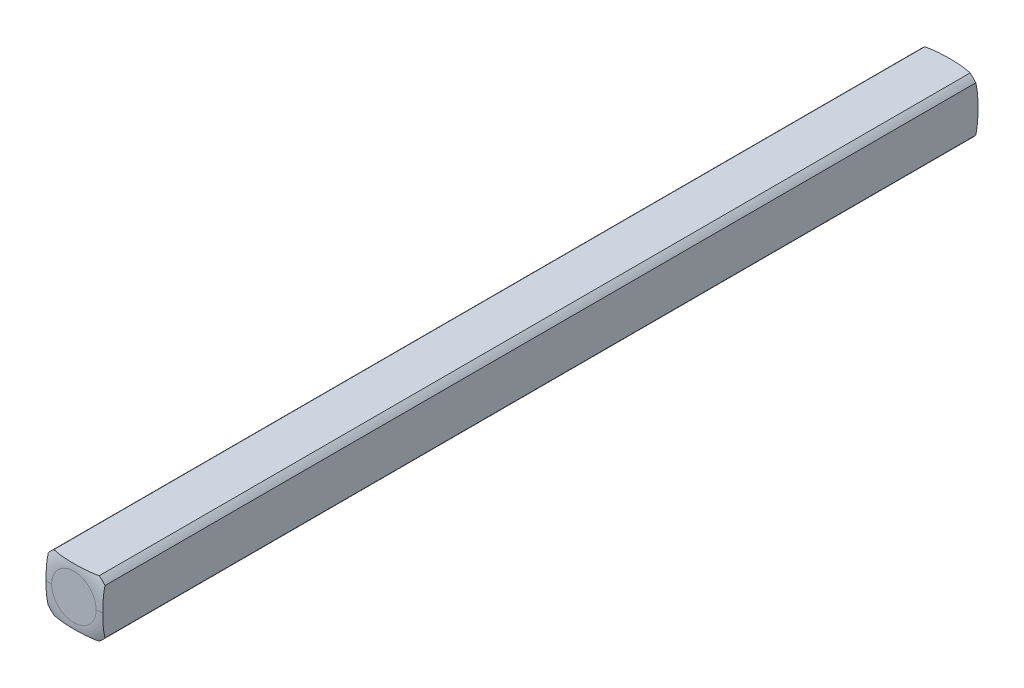
ISO-10303-21;
HEADER;
FILE_DESCRIPTION(('STEP AP214'),'2;1');
FILE_NAME('part.step','',(''),(''),'','','');
FILE_SCHEMA(('AUTOMOTIVE_DESIGN { 1 0 10303 214 1 1 1 1 }'));
ENDSEC;
DATA;
#1=APPLICATION_CONTEXT('core data for automotive mechanical design processes');
#2=APPLICATION_PROTOCOL_DEFINITION('international standard','automotive_design',2000,#1);
#3=PRODUCT_CONTEXT('',#1,'mechanical');
#4=PRODUCT('Part','Part','',(#3));
#5=PRODUCT_RELATED_PRODUCT_CATEGORY('part','',(#4));
#6=PRODUCT_DEFINITION_FORMATION('','',#4);
#7=PRODUCT_DEFINITION_CONTEXT('part definition',#1,'design');
#8=PRODUCT_DEFINITION('design','',#6,#7);
#9=PRODUCT_DEFINITION_SHAPE('','',#8);
#10=(LENGTH_UNIT() NAMED_UNIT(*) SI_UNIT(.MILLI.,.METRE.));
#11=(NAMED_UNIT(*) PLANE_ANGLE_UNIT() SI_UNIT($,.RADIAN.));
#12=(NAMED_UNIT(*) SI_UNIT($,.STERADIAN.) SOLID_ANGLE_UNIT());
#13=UNCERTAINTY_MEASURE_WITH_UNIT(LENGTH_MEASURE(1.E-05),#10,'distance_accuracy_value','');
#14=(GEOMETRIC_REPRESENTATION_CONTEXT(3) GLOBAL_UNCERTAINTY_ASSIGNED_CONTEXT((#13)) GLOBAL_UNIT_ASSIGNED_CONTEXT((#10,
#11,#12)) REPRESENTATION_CONTEXT('',''));
#15=CARTESIAN_POINT('',(0.,0.,0.));
#16=DIRECTION('',(0.,0.,1.));
#17=DIRECTION('',(1.,0.,0.));
#18=AXIS2_PLACEMENT_3D('',#15,#16,#17);
#19=CARTESIAN_POINT('',(0.,0.,-24.511));
#20=DIRECTION('',(0.,0.,1.));
#21=DIRECTION('',(1.,0.,0.));
#22=AXIS2_PLACEMENT_3D('',#19,#20,#21);
#23=CYLINDRICAL_SURFACE('',#22,2.032);
#24=CARTESIAN_POINT('',(0.,0.,-24.359919142098));
#25=DIRECTION('',(0.,0.,1.));
#26=DIRECTION('',(1.,0.,0.));
#27=AXIS2_PLACEMENT_3D('',#24,#25,#26);
#28=CIRCLE('',#27,2.032);
#29=CARTESIAN_POINT('',(-1.26841150657032,1.5875,-24.359919142098));
#30=VERTEX_POINT('',#29);
#31=CARTESIAN_POINT('',(-1.5875,1.26841150657032,-24.359919142098));
#32=VERTEX_POINT('',#31);
#33=EDGE_CURVE('E145',#30,#32,#28,.T.);
#34=ORIENTED_EDGE('',*,*,#33,.T.);
#35=DIRECTION('',(0.,0.,1.));
#36=VECTOR('',#35,1.);
#37=CARTESIAN_POINT('',(-1.5875,1.26841150657032,-24.511));
#38=LINE('',#37,#36);
#39=CARTESIAN_POINT('',(-1.5875,1.26841150657032,24.359919142098));
#40=VERTEX_POINT('',#39);
#41=EDGE_CURVE('E125',#32,#40,#38,.T.);
#42=ORIENTED_EDGE('',*,*,#41,.T.);
#43=CARTESIAN_POINT('',(0.,0.,24.359919142098));
#44=DIRECTION('',(0.,0.,-1.));
#45=DIRECTION('',(-1.,0.,0.));
#46=AXIS2_PLACEMENT_3D('',#43,#44,#45);
#47=CIRCLE('',#46,2.032);
#48=CARTESIAN_POINT('',(-1.26841150657032,1.5875,24.359919142098));
#49=VERTEX_POINT('',#48);
#50=EDGE_CURVE('E9',#40,#49,#47,.T.);
#51=ORIENTED_EDGE('',*,*,#50,.T.);
#52=DIRECTION('',(0.,0.,-1.));
#53=VECTOR('',#52,1.);
#54=CARTESIAN_POINT('',(-1.26841150657032,1.5875,-24.511));
#55=LINE('',#54,#53);
#56=EDGE_CURVE('E143',#49,#30,#55,.T.);
#57=ORIENTED_EDGE('',*,*,#56,.T.);
#58=EDGE_LOOP('',(#34,#42,#51,#57));
#59=FACE_BOUND('',#58,.T.);
#60=ADVANCED_FACE('F15',(#59),#23,.T.);
#61=CARTESIAN_POINT('',(0.,0.,-24.511));
#62=DIRECTION('',(0.,0.,1.));
#63=DIRECTION('',(1.,0.,0.));
#64=AXIS2_PLACEMENT_3D('',#61,#62,#63);
#65=CYLINDRICAL_SURFACE('',#64,2.032);
#66=CARTESIAN_POINT('',(0.,0.,-24.359919142098));
#67=DIRECTION('',(0.,0.,1.));
#68=DIRECTION('',(1.,0.,0.));
#69=AXIS2_PLACEMENT_3D('',#66,#67,#68);
#70=CIRCLE('',#69,2.032);
#71=CARTESIAN_POINT('',(1.5875,1.26841150657032,-24.359919142098));
#72=VERTEX_POINT('',#71);
#73=CARTESIAN_POINT('',(1.26841150657032,1.5875,-24.359919142098));
#74=VERTEX_POINT('',#73);
#75=EDGE_CURVE('E419',#72,#74,#70,.T.);
#76=ORIENTED_EDGE('',*,*,#75,.T.);
#77=DIRECTION('',(0.,0.,1.));
#78=VECTOR('',#77,1.);
#79=CARTESIAN_POINT('',(1.26841150657032,1.5875,-24.511));
#80=LINE('',#79,#78);
#81=CARTESIAN_POINT('',(1.26841150657032,1.5875,24.359919142098));
#82=VERTEX_POINT('',#81);
#83=EDGE_CURVE('E435',#74,#82,#80,.T.);
#84=ORIENTED_EDGE('',*,*,#83,.T.);
#85=CARTESIAN_POINT('',(0.,0.,24.359919142098));
#86=DIRECTION('',(0.,0.,-1.));
#87=DIRECTION('',(-1.,0.,0.));
#88=AXIS2_PLACEMENT_3D('',#85,#86,#87);
#89=CIRCLE('',#88,2.032);
#90=CARTESIAN_POINT('',(1.5875,1.26841150657032,24.359919142098));
#91=VERTEX_POINT('',#90);
#92=EDGE_CURVE('E30',#82,#91,#89,.T.);
#93=ORIENTED_EDGE('',*,*,#92,.T.);
#94=DIRECTION('',(0.,0.,-1.));
#95=VECTOR('',#94,1.);
#96=CARTESIAN_POINT('',(1.5875,1.26841150657032,-24.511));
#97=LINE('',#96,#95);
#98=EDGE_CURVE('E262',#91,#72,#97,.T.);
#99=ORIENTED_EDGE('',*,*,#98,.T.);
#100=EDGE_LOOP('',(#76,#84,#93,#99));
#101=FACE_BOUND('',#100,.T.);
#102=ADVANCED_FACE('F589',(#101),#65,.T.);
#103=CARTESIAN_POINT('',(0.,0.,-24.511));
#104=DIRECTION('',(0.,0.,1.));
#105=DIRECTION('',(1.,0.,0.));
#106=AXIS2_PLACEMENT_3D('',#103,#104,#105);
#107=CYLINDRICAL_SURFACE('',#106,2.032);
#108=CARTESIAN_POINT('',(0.,0.,-24.359919142098));
#109=DIRECTION('',(0.,0.,1.));
#110=DIRECTION('',(1.,0.,0.));
#111=AXIS2_PLACEMENT_3D('',#108,#109,#110);
#112=CIRCLE('',#111,2.032);
#113=CARTESIAN_POINT('',(1.26841150657032,-1.5875,-24.359919142098));
#114=VERTEX_POINT('',#113);
#115=CARTESIAN_POINT('',(1.5875,-1.26841150657032,-24.359919142098));
#116=VERTEX_POINT('',#115);
#117=EDGE_CURVE('E87',#114,#116,#112,.T.);
#118=ORIENTED_EDGE('',*,*,#117,.T.);
#119=DIRECTION('',(0.,0.,1.));
#120=VECTOR('',#119,1.);
#121=CARTESIAN_POINT('',(1.5875,-1.26841150657032,-24.511));
#122=LINE('',#121,#120);
#123=CARTESIAN_POINT('',(1.5875,-1.26841150657032,24.359919142098));
#124=VERTEX_POINT('',#123);
#125=EDGE_CURVE('E311',#116,#124,#122,.T.);
#126=ORIENTED_EDGE('',*,*,#125,.T.);
#127=CARTESIAN_POINT('',(0.,0.,24.359919142098));
#128=DIRECTION('',(0.,0.,-1.));
#129=DIRECTION('',(-1.,0.,0.));
#130=AXIS2_PLACEMENT_3D('',#127,#128,#129);
#131=CIRCLE('',#130,2.032);
#132=CARTESIAN_POINT('',(1.26841150657032,-1.5875,24.359919142098));
#133=VERTEX_POINT('',#132);
#134=EDGE_CURVE('E464',#124,#133,#131,.T.);
#135=ORIENTED_EDGE('',*,*,#134,.T.);
#136=DIRECTION('',(0.,0.,-1.));
#137=VECTOR('',#136,1.);
#138=CARTESIAN_POINT('',(1.26841150657032,-1.5875,-24.511));
#139=LINE('',#138,#137);
#140=EDGE_CURVE('E314',#133,#114,#139,.T.);
#141=ORIENTED_EDGE('',*,*,#140,.T.);
#142=EDGE_LOOP('',(#118,#126,#135,#141));
#143=FACE_BOUND('',#142,.T.);
#144=ADVANCED_FACE('F178',(#143),#107,.T.);
#145=CARTESIAN_POINT('',(0.,0.,-24.511));
#146=DIRECTION('',(0.,0.,1.));
#147=DIRECTION('',(1.,0.,0.));
#148=AXIS2_PLACEMENT_3D('',#145,#146,#147);
#149=CYLINDRICAL_SURFACE('',#148,2.032);
#150=CARTESIAN_POINT('',(0.,0.,-24.359919142098));
#151=DIRECTION('',(0.,0.,1.));
#152=DIRECTION('',(1.,0.,0.));
#153=AXIS2_PLACEMENT_3D('',#150,#151,#152);
#154=CIRCLE('',#153,2.032);
#155=CARTESIAN_POINT('',(-1.5875,-1.26841150657032,-24.359919142098));
#156=VERTEX_POINT('',#155);
#157=CARTESIAN_POINT('',(-1.26841150657032,-1.5875,-24.359919142098));
#158=VERTEX_POINT('',#157);
#159=EDGE_CURVE('E309',#156,#158,#154,.T.);
#160=ORIENTED_EDGE('',*,*,#159,.T.);
#161=DIRECTION('',(0.,0.,1.));
#162=VECTOR('',#161,1.);
#163=CARTESIAN_POINT('',(-1.26841150657032,-1.5875,-24.511));
#164=LINE('',#163,#162);
#165=CARTESIAN_POINT('',(-1.26841150657032,-1.5875,24.359919142098));
#166=VERTEX_POINT('',#165);
#167=EDGE_CURVE('E355',#158,#166,#164,.T.);
#168=ORIENTED_EDGE('',*,*,#167,.T.);
#169=CARTESIAN_POINT('',(0.,0.,24.359919142098));
#170=DIRECTION('',(0.,0.,-1.));
#171=DIRECTION('',(-1.,0.,0.));
#172=AXIS2_PLACEMENT_3D('',#169,#170,#171);
#173=CIRCLE('',#172,2.032);
#174=CARTESIAN_POINT('',(-1.5875,-1.26841150657032,24.359919142098));
#175=VERTEX_POINT('',#174);
#176=EDGE_CURVE('E486',#166,#175,#173,.T.);
#177=ORIENTED_EDGE('',*,*,#176,.T.);
#178=DIRECTION('',(0.,0.,-1.));
#179=VECTOR('',#178,1.);
#180=CARTESIAN_POINT('',(-1.5875,-1.26841150657032,-24.511));
#181=LINE('',#180,#179);
#182=EDGE_CURVE('E399',#175,#156,#181,.T.);
#183=ORIENTED_EDGE('',*,*,#182,.T.);
#184=EDGE_LOOP('',(#160,#168,#177,#183));
#185=FACE_BOUND('',#184,.T.);
#186=ADVANCED_FACE('F251',(#185),#149,.T.);
#187=CARTESIAN_POINT('',(-1.5875,1.5875,24.511));
#188=DIRECTION('',(0.,0.,-1.));
#189=DIRECTION('',(0.,-1.,0.));
#190=AXIS2_PLACEMENT_3D('',#187,#188,#189);
#191=PLANE('',#190);
#192=CARTESIAN_POINT('',(0.,0.,24.511));
#193=DIRECTION('',(0.,0.,1.));
#194=DIRECTION('',(1.,0.,0.));
#195=AXIS2_PLACEMENT_3D('',#192,#193,#194);
#196=CIRCLE('',#195,1.24506403026729);
#197=CARTESIAN_POINT('',(1.24506403026729,0.,24.511));
#198=VERTEX_POINT('',#197);
#199=CARTESIAN_POINT('',(-1.24506403026729,0.,24.511));
#200=VERTEX_POINT('',#199);
#201=EDGE_CURVE('E347',#198,#200,#196,.T.);
#202=ORIENTED_EDGE('',*,*,#201,.T.);
#203=CARTESIAN_POINT('',(0.,0.,24.511));
#204=DIRECTION('',(0.,0.,1.));
#205=DIRECTION('',(1.,0.,0.));
#206=AXIS2_PLACEMENT_3D('',#203,#204,#205);
#207=CIRCLE('',#206,1.24506403026729);
#208=EDGE_CURVE('E520',#200,#198,#207,.T.);
#209=ORIENTED_EDGE('',*,*,#208,.T.);
#210=EDGE_LOOP('',(#202,#209));
#211=FACE_BOUND('',#210,.T.);
#212=ADVANCED_FACE('F630',(#211),#191,.F.);
#213=CARTESIAN_POINT('',(-1.5875,1.5875,-24.511));
#214=DIRECTION('',(0.,0.,-1.));
#215=DIRECTION('',(0.,-1.,0.));
#216=AXIS2_PLACEMENT_3D('',#213,#214,#215);
#217=PLANE('',#216);
#218=CARTESIAN_POINT('',(0.,0.,-24.511));
#219=DIRECTION('',(0.,0.,1.));
#220=DIRECTION('',(1.,0.,0.));
#221=AXIS2_PLACEMENT_3D('',#218,#219,#220);
#222=CIRCLE('',#221,1.24506403026729);
#223=CARTESIAN_POINT('',(1.24506403026729,0.,-24.511));
#224=VERTEX_POINT('',#223);
#225=CARTESIAN_POINT('',(-1.24506403026729,0.,-24.511));
#226=VERTEX_POINT('',#225);
#227=EDGE_CURVE('E279',#224,#226,#222,.T.);
#228=ORIENTED_EDGE('',*,*,#227,.F.);
#229=CARTESIAN_POINT('',(0.,0.,-24.511));
#230=DIRECTION('',(0.,0.,1.));
#231=DIRECTION('',(1.,0.,0.));
#232=AXIS2_PLACEMENT_3D('',#229,#230,#231);
#233=CIRCLE('',#232,1.24506403026729);
#234=EDGE_CURVE('E306',#226,#224,#233,.T.);
#235=ORIENTED_EDGE('',*,*,#234,.F.);
#236=EDGE_LOOP('',(#228,#235));
#237=FACE_BOUND('',#236,.T.);
#238=ADVANCED_FACE('F255',(#237),#217,.T.);
#239=CARTESIAN_POINT('',(0.,0.,22.386));
#240=DIRECTION('',(0.,0.,-1.));
#241=DIRECTION('',(1.,0.,0.));
#242=AXIS2_PLACEMENT_3D('',#239,#240,#241);
#243=DEGENERATE_TOROIDAL_SURFACE('',#242,1.24506403026729,2.125,.T.);
#244=CARTESIAN_POINT('',(-1.24506403026729,0.,22.386));
#245=DIRECTION('',(0.,-1.,0.));
#246=DIRECTION('',(1.,0.,0.));
#247=AXIS2_PLACEMENT_3D('',#244,#245,#246);
#248=CIRCLE('',#247,2.125);
#249=CARTESIAN_POINT('',(-1.5875,0.,24.4832273616928));
#250=VERTEX_POINT('',#249);
#251=EDGE_CURVE('E512',#200,#250,#248,.T.);
#252=ORIENTED_EDGE('',*,*,#251,.F.);
#253=ORIENTED_EDGE('',*,*,#201,.F.);
#254=CARTESIAN_POINT('',(1.24506403026729,0.,22.386));
#255=DIRECTION('',(0.,1.,0.));
#256=DIRECTION('',(0.,0.,1.));
#257=AXIS2_PLACEMENT_3D('',#254,#255,#256);
#258=CIRCLE('',#257,2.125);
#259=CARTESIAN_POINT('',(1.5875,0.,24.4832273616928));
#260=VERTEX_POINT('',#259);
#261=EDGE_CURVE('E274',#198,#260,#258,.T.);
#262=ORIENTED_EDGE('',*,*,#261,.T.);
#263=CARTESIAN_POINT('',(1.5875,1.26841150657033,24.359919142098));
#264=CARTESIAN_POINT('',(1.5875,0.987077094928455,24.429930639131));
#265=CARTESIAN_POINT('',(1.5875,0.63953045901757,24.4591819538896));
#266=CARTESIAN_POINT('',(1.5875,0.353837297528445,24.4832273616929));
#267=CARTESIAN_POINT('',(1.5875,0.,24.4832273616929));
#268=B_SPLINE_CURVE_WITH_KNOTS('',2,(#263,#264,#265,#266,#267),.UNSPECIFIED.,.F.,.F.,(3,2,3),
(0.,0.5,1.),.UNSPECIFIED.);
#269=EDGE_CURVE('E273',#91,#260,#268,.T.);
#270=ORIENTED_EDGE('',*,*,#269,.F.);
#271=ORIENTED_EDGE('',*,*,#92,.F.);
#272=CARTESIAN_POINT('',(-1.26841150657032,1.5875,24.359919142098));
#273=CARTESIAN_POINT('',(-0.770338232200867,1.5875,24.4838672057821));
#274=CARTESIAN_POINT('',(0.00849337593367507,1.5875,24.4832236517902));
#275=CARTESIAN_POINT('',(0.775470990407875,1.5875,24.482589892836));
#276=CARTESIAN_POINT('',(1.26841150657033,1.5875,24.359919142098));
#277=B_SPLINE_CURVE_WITH_KNOTS('',2,(#272,#273,#274,#275,#276),.UNSPECIFIED.,.F.,.F.,(3,2,3),
(0.,0.5,1.),.UNSPECIFIED.);
#278=EDGE_CURVE('E240',#49,#82,#277,.T.);
#279=ORIENTED_EDGE('',*,*,#278,.F.);
#280=ORIENTED_EDGE('',*,*,#50,.F.);
#281=CARTESIAN_POINT('',(-1.5875,0.,24.4832273616929));
#282=CARTESIAN_POINT('',(-1.5875,0.35317995732696,24.4832273616929));
#283=CARTESIAN_POINT('',(-1.5875,0.6395293222865,24.4591820494506));
#284=CARTESIAN_POINT('',(-1.5875,0.986669843198645,24.4300319857917));
#285=CARTESIAN_POINT('',(-1.5875,1.26841150657033,24.359919142098));
#286=B_SPLINE_CURVE_WITH_KNOTS('',2,(#281,#282,#283,#284,#285),.UNSPECIFIED.,.F.,.F.,(3,2,3),
(0.,0.5,1.),.UNSPECIFIED.);
#287=EDGE_CURVE('E134',#250,#40,#286,.T.);
#288=ORIENTED_EDGE('',*,*,#287,.F.);
#289=EDGE_LOOP('',(#252,#253,#262,#270,#271,#279,#280,#288));
#290=FACE_BOUND('',#289,.T.);
#291=ADVANCED_FACE('F242',(#290),#243,.T.);
#292=CARTESIAN_POINT('',(0.,0.,-22.386));
#293=DIRECTION('',(0.,0.,1.));
#294=DIRECTION('',(1.,0.,0.));
#295=AXIS2_PLACEMENT_3D('',#292,#293,#294);
#296=DEGENERATE_TOROIDAL_SURFACE('',#295,1.24506403026729,2.125,.T.);
#297=CARTESIAN_POINT('',(-1.24506403026729,0.,-22.386));
#298=DIRECTION('',(0.,1.,0.));
#299=DIRECTION('',(-1.,0.,0.));
#300=AXIS2_PLACEMENT_3D('',#297,#298,#299);
#301=CIRCLE('',#300,2.125);
#302=CARTESIAN_POINT('',(-1.5875,0.,-24.4832273616928));
#303=VERTEX_POINT('',#302);
#304=EDGE_CURVE('E154',#226,#303,#301,.T.);
#305=ORIENTED_EDGE('',*,*,#304,.F.);
#306=ORIENTED_EDGE('',*,*,#234,.T.);
#307=CARTESIAN_POINT('',(1.24506403026729,0.,-22.386));
#308=DIRECTION('',(0.,-1.,0.));
#309=DIRECTION('',(0.,0.,-1.));
#310=AXIS2_PLACEMENT_3D('',#307,#308,#309);
#311=CIRCLE('',#310,2.125);
#312=CARTESIAN_POINT('',(1.5875,0.,-24.4832273616928));
#313=VERTEX_POINT('',#312);
#314=EDGE_CURVE('E136',#224,#313,#311,.T.);
#315=ORIENTED_EDGE('',*,*,#314,.T.);
#316=CARTESIAN_POINT('',(1.5875,-1.26841150657032,-24.359919142098));
#317=CARTESIAN_POINT('',(1.5875,-0.987077094928433,-24.429930639131));
#318=CARTESIAN_POINT('',(1.5875,-0.639530459017569,-24.4591819538896));
#319=CARTESIAN_POINT('',(1.5875,-0.353837297528488,-24.4832273616929));
#320=CARTESIAN_POINT('',(1.5875,0.,-24.4832273616929));
#321=B_SPLINE_CURVE_WITH_KNOTS('',2,(#316,#317,#318,#319,#320),.UNSPECIFIED.,.F.,.F.,(3,2,3),
(0.,0.5,1.),.UNSPECIFIED.);
#322=EDGE_CURVE('E272',#116,#313,#321,.T.);
#323=ORIENTED_EDGE('',*,*,#322,.F.);
#324=ORIENTED_EDGE('',*,*,#117,.F.);
#325=CARTESIAN_POINT('',(-1.26841150657032,-1.5875,-24.359919142098));
#326=CARTESIAN_POINT('',(-0.770338232200853,-1.5875,-24.4838672057821));
#327=CARTESIAN_POINT('',(0.00849337593367507,-1.5875,-24.4832236517902));
#328=CARTESIAN_POINT('',(0.77547099040786,-1.5875,-24.482589892836));
#329=CARTESIAN_POINT('',(1.26841150657033,-1.5875,-24.359919142098));
#330=B_SPLINE_CURVE_WITH_KNOTS('',2,(#325,#326,#327,#328,#329),.UNSPECIFIED.,.F.,.F.,(3,2,3),
(0.,0.5,1.),.UNSPECIFIED.);
#331=EDGE_CURVE('E330',#158,#114,#330,.T.);
#332=ORIENTED_EDGE('',*,*,#331,.F.);
#333=ORIENTED_EDGE('',*,*,#159,.F.);
#334=CARTESIAN_POINT('',(-1.5875,0.,-24.4832273616929));
#335=CARTESIAN_POINT('',(-1.5875,-0.353179957326886,-24.4832273616929));
#336=CARTESIAN_POINT('',(-1.5875,-0.639529322286499,-24.4591820494506));
#337=CARTESIAN_POINT('',(-1.5875,-0.98666984319855,-24.4300319857917));
#338=CARTESIAN_POINT('',(-1.5875,-1.26841150657032,-24.359919142098));
#339=B_SPLINE_CURVE_WITH_KNOTS('',2,(#334,#335,#336,#337,#338),.UNSPECIFIED.,.F.,.F.,(3,2,3),
(0.,0.5,1.),.UNSPECIFIED.);
#340=EDGE_CURVE('E139',#303,#156,#339,.T.);
#341=ORIENTED_EDGE('',*,*,#340,.F.);
#342=EDGE_LOOP('',(#305,#306,#315,#323,#324,#332,#333,#341));
#343=FACE_BOUND('',#342,.T.);
#344=ADVANCED_FACE('F218',(#343),#296,.T.);
#345=CARTESIAN_POINT('',(-1.5875,1.5875,24.511));
#346=DIRECTION('',(0.,-1.,0.));
#347=DIRECTION('',(0.,0.,-1.));
#348=AXIS2_PLACEMENT_3D('',#345,#346,#347);
#349=PLANE('',#348);
#350=ORIENTED_EDGE('',*,*,#83,.F.);
#351=CARTESIAN_POINT('',(1.26841150657033,1.5875,-24.359919142098));
#352=CARTESIAN_POINT('',(0.770338232200855,1.5875,-24.4838672057821));
#353=CARTESIAN_POINT('',(-0.00849337593367486,1.5875,-24.4832236517902));
#354=CARTESIAN_POINT('',(-0.775470990407859,1.5875,-24.482589892836));
#355=CARTESIAN_POINT('',(-1.26841150657032,1.5875,-24.359919142098));
#356=B_SPLINE_CURVE_WITH_KNOTS('',2,(#351,#352,#353,#354,#355),.UNSPECIFIED.,.F.,.F.,(3,2,3),
(0.,0.5,1.),.UNSPECIFIED.);
#357=EDGE_CURVE('E146',#74,#30,#356,.T.);
#358=ORIENTED_EDGE('',*,*,#357,.T.);
#359=ORIENTED_EDGE('',*,*,#56,.F.);
#360=ORIENTED_EDGE('',*,*,#278,.T.);
#361=EDGE_LOOP('',(#350,#358,#359,#360));
#362=FACE_BOUND('',#361,.T.);
#363=ADVANCED_FACE('F207',(#362),#349,.F.);
#364=CARTESIAN_POINT('',(1.5875,-1.5875,24.511));
#365=DIRECTION('',(-1.,0.,0.));
#366=DIRECTION('',(0.,0.,1.));
#367=AXIS2_PLACEMENT_3D('',#364,#365,#366);
#368=PLANE('',#367);
#369=ORIENTED_EDGE('',*,*,#125,.F.);
#370=ORIENTED_EDGE('',*,*,#322,.T.);
#371=CARTESIAN_POINT('',(1.5875,0.,-24.4832273616929));
#372=CARTESIAN_POINT('',(1.5875,0.35317995737045,-24.4832273616929));
#373=CARTESIAN_POINT('',(1.5875,0.6395293222865,-24.4591820494506));
#374=CARTESIAN_POINT('',(1.5875,0.98666984322554,-24.430031985785));
#375=CARTESIAN_POINT('',(1.5875,1.26841150657033,-24.359919142098));
#376=B_SPLINE_CURVE_WITH_KNOTS('',2,(#371,#372,#373,#374,#375),.UNSPECIFIED.,.F.,.F.,(3,2,3),
(0.,0.5,1.),.UNSPECIFIED.);
#377=EDGE_CURVE('E318',#313,#72,#376,.T.);
#378=ORIENTED_EDGE('',*,*,#377,.T.);
#379=ORIENTED_EDGE('',*,*,#98,.F.);
#380=ORIENTED_EDGE('',*,*,#269,.T.);
#381=CARTESIAN_POINT('',(1.5875,0.,24.4832273616929));
#382=CARTESIAN_POINT('',(1.5875,-0.353179957359536,24.4832273616929));
#383=CARTESIAN_POINT('',(1.5875,-0.639529322286499,24.4591820494506));
#384=CARTESIAN_POINT('',(1.5875,-0.986669843218794,24.4300319857867));
#385=CARTESIAN_POINT('',(1.5875,-1.26841150657032,24.359919142098));
#386=B_SPLINE_CURVE_WITH_KNOTS('',2,(#381,#382,#383,#384,#385),.UNSPECIFIED.,.F.,.F.,(3,2,3),
(0.,0.5,1.),.UNSPECIFIED.);
#387=EDGE_CURVE('E277',#260,#124,#386,.T.);
#388=ORIENTED_EDGE('',*,*,#387,.T.);
#389=EDGE_LOOP('',(#369,#370,#378,#379,#380,#388));
#390=FACE_BOUND('',#389,.T.);
#391=ADVANCED_FACE('F179',(#390),#368,.F.);
#392=CARTESIAN_POINT('',(-1.5875,-1.5875,24.511));
#393=DIRECTION('',(0.,1.,0.));
#394=DIRECTION('',(1.,0.,0.));
#395=AXIS2_PLACEMENT_3D('',#392,#393,#394);
#396=PLANE('',#395);
#397=ORIENTED_EDGE('',*,*,#167,.F.);
#398=ORIENTED_EDGE('',*,*,#331,.T.);
#399=ORIENTED_EDGE('',*,*,#140,.F.);
#400=CARTESIAN_POINT('',(1.26841150657033,-1.5875,24.359919142098));
#401=CARTESIAN_POINT('',(0.77033823220087,-1.5875,24.4838672057821));
#402=CARTESIAN_POINT('',(-0.00849337593367486,-1.5875,24.4832236517902));
#403=CARTESIAN_POINT('',(-0.775470990407873,-1.5875,24.482589892836));
#404=CARTESIAN_POINT('',(-1.26841150657032,-1.5875,24.359919142098));
#405=B_SPLINE_CURVE_WITH_KNOTS('',2,(#400,#401,#402,#403,#404),.UNSPECIFIED.,.F.,.F.,(3,2,3),
(0.,0.5,1.),.UNSPECIFIED.);
#406=EDGE_CURVE('E499',#133,#166,#405,.T.);
#407=ORIENTED_EDGE('',*,*,#406,.T.);
#408=EDGE_LOOP('',(#397,#398,#399,#407));
#409=FACE_BOUND('',#408,.T.);
#410=ADVANCED_FACE('F216',(#409),#396,.F.);
#411=CARTESIAN_POINT('',(-1.5875,-1.5875,24.511));
#412=DIRECTION('',(1.,0.,0.));
#413=DIRECTION('',(0.,1.,0.));
#414=AXIS2_PLACEMENT_3D('',#411,#412,#413);
#415=PLANE('',#414);
#416=ORIENTED_EDGE('',*,*,#41,.F.);
#417=CARTESIAN_POINT('',(-1.5875,1.26841150657033,-24.359919142098));
#418=CARTESIAN_POINT('',(-1.5875,0.987077094928435,-24.429930639131));
#419=CARTESIAN_POINT('',(-1.5875,0.63953045901757,-24.4591819538896));
#420=CARTESIAN_POINT('',(-1.5875,0.35383729752849,-24.4832273616929));
#421=CARTESIAN_POINT('',(-1.5875,0.,-24.4832273616929));
#422=B_SPLINE_CURVE_WITH_KNOTS('',2,(#417,#418,#419,#420,#421),.UNSPECIFIED.,.F.,.F.,(3,2,3),
(0.,0.5,1.),.UNSPECIFIED.);
#423=EDGE_CURVE('E128',#32,#303,#422,.T.);
#424=ORIENTED_EDGE('',*,*,#423,.T.);
#425=ORIENTED_EDGE('',*,*,#340,.T.);
#426=ORIENTED_EDGE('',*,*,#182,.F.);
#427=CARTESIAN_POINT('',(-1.5875,-1.26841150657032,24.359919142098));
#428=CARTESIAN_POINT('',(-1.5875,-0.987077094928454,24.429930639131));
#429=CARTESIAN_POINT('',(-1.5875,-0.639530459017569,24.4591819538896));
#430=CARTESIAN_POINT('',(-1.5875,-0.353837297528446,24.4832273616929));
#431=CARTESIAN_POINT('',(-1.5875,0.,24.4832273616929));
#432=B_SPLINE_CURVE_WITH_KNOTS('',2,(#427,#428,#429,#430,#431),.UNSPECIFIED.,.F.,.F.,(3,2,3),
(0.,0.5,1.),.UNSPECIFIED.);
#433=EDGE_CURVE('E496',#175,#250,#432,.T.);
#434=ORIENTED_EDGE('',*,*,#433,.T.);
#435=ORIENTED_EDGE('',*,*,#287,.T.);
#436=EDGE_LOOP('',(#416,#424,#425,#426,#434,#435));
#437=FACE_BOUND('',#436,.T.);
#438=ADVANCED_FACE('F130',(#437),#415,.F.);
#439=CARTESIAN_POINT('',(0.,0.,-22.386));
#440=DIRECTION('',(0.,0.,1.));
#441=DIRECTION('',(1.,0.,0.));
#442=AXIS2_PLACEMENT_3D('',#439,#440,#441);
#443=DEGENERATE_TOROIDAL_SURFACE('',#442,1.24506403026729,2.125,.T.);
#444=ORIENTED_EDGE('',*,*,#227,.T.);
#445=ORIENTED_EDGE('',*,*,#304,.T.);
#446=ORIENTED_EDGE('',*,*,#423,.F.);
#447=ORIENTED_EDGE('',*,*,#33,.F.);
#448=ORIENTED_EDGE('',*,*,#357,.F.);
#449=ORIENTED_EDGE('',*,*,#75,.F.);
#450=ORIENTED_EDGE('',*,*,#377,.F.);
#451=ORIENTED_EDGE('',*,*,#314,.F.);
#452=EDGE_LOOP('',(#444,#445,#446,#447,#448,#449,#450,#451));
#453=FACE_BOUND('',#452,.T.);
#454=ADVANCED_FACE('F151',(#453),#443,.T.);
#455=CARTESIAN_POINT('',(0.,0.,22.386));
#456=DIRECTION('',(0.,0.,-1.));
#457=DIRECTION('',(1.,0.,0.));
#458=AXIS2_PLACEMENT_3D('',#455,#456,#457);
#459=DEGENERATE_TOROIDAL_SURFACE('',#458,1.24506403026729,2.125,.T.);
#460=ORIENTED_EDGE('',*,*,#208,.F.);
#461=ORIENTED_EDGE('',*,*,#251,.T.);
#462=ORIENTED_EDGE('',*,*,#433,.F.);
#463=ORIENTED_EDGE('',*,*,#176,.F.);
#464=ORIENTED_EDGE('',*,*,#406,.F.);
#465=ORIENTED_EDGE('',*,*,#134,.F.);
#466=ORIENTED_EDGE('',*,*,#387,.F.);
#467=ORIENTED_EDGE('',*,*,#261,.F.);
#468=EDGE_LOOP('',(#460,#461,#462,#463,#464,#465,#466,#467));
#469=FACE_BOUND('',#468,.T.);
#470=ADVANCED_FACE('F180',(#469),#459,.T.);
#471=CLOSED_SHELL('',(#60,#102,#144,#186,#212,#238,#291,#344,#363,#391,#410,#438,#454,#470));
#472=MANIFOLD_SOLID_BREP('B1',#471);
#473=ADVANCED_BREP_SHAPE_REPRESENTATION('',(#18,#472),#14);
#474=SHAPE_DEFINITION_REPRESENTATION(#9,#473);
ENDSEC;
END-ISO-10303-21;
